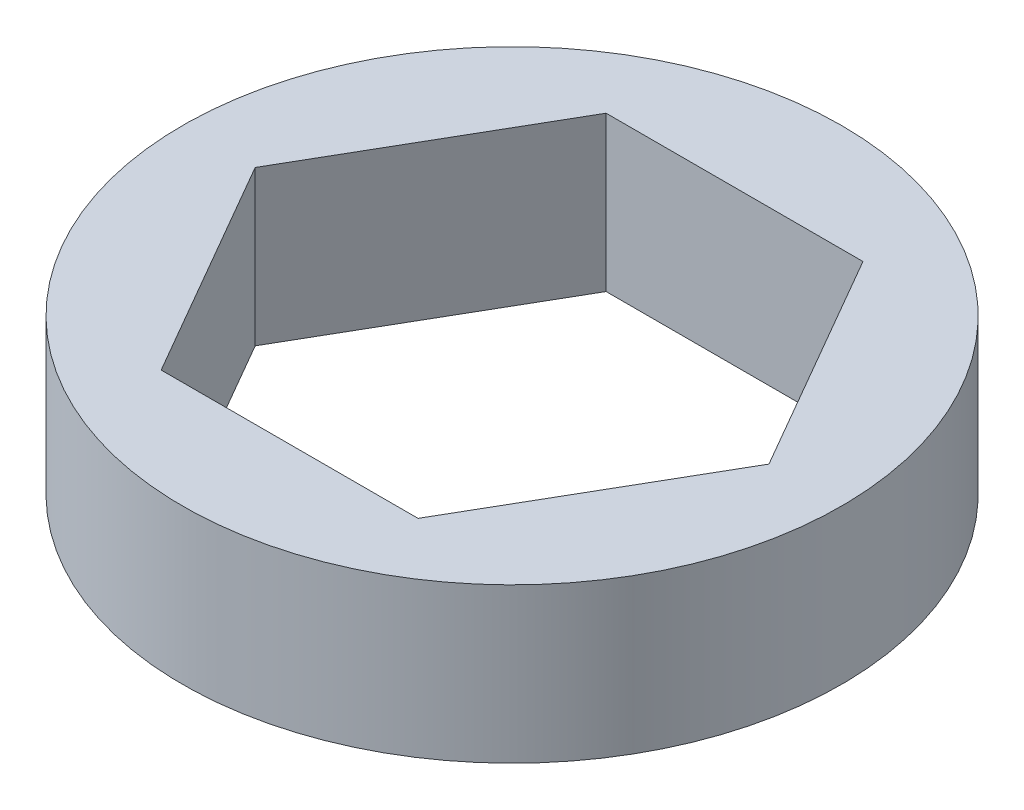
ISO-10303-21;
HEADER;
FILE_DESCRIPTION(('STEP AP214'),'2;1');
FILE_NAME('part.step','',(''),(''),'','','');
FILE_SCHEMA(('AUTOMOTIVE_DESIGN { 1 0 10303 214 1 1 1 1 }'));
ENDSEC;
DATA;
#1=APPLICATION_CONTEXT('core data for automotive mechanical design processes');
#2=APPLICATION_PROTOCOL_DEFINITION('international standard','automotive_design',2000,#1);
#3=PRODUCT_CONTEXT('',#1,'mechanical');
#4=PRODUCT('Part','Part','',(#3));
#5=PRODUCT_RELATED_PRODUCT_CATEGORY('part','',(#4));
#6=PRODUCT_DEFINITION_FORMATION('','',#4);
#7=PRODUCT_DEFINITION_CONTEXT('part definition',#1,'design');
#8=PRODUCT_DEFINITION('design','',#6,#7);
#9=PRODUCT_DEFINITION_SHAPE('','',#8);
#10=(LENGTH_UNIT() NAMED_UNIT(*) SI_UNIT(.MILLI.,.METRE.));
#11=(NAMED_UNIT(*) PLANE_ANGLE_UNIT() SI_UNIT($,.RADIAN.));
#12=(NAMED_UNIT(*) SI_UNIT($,.STERADIAN.) SOLID_ANGLE_UNIT());
#13=UNCERTAINTY_MEASURE_WITH_UNIT(LENGTH_MEASURE(1.E-05),#10,'distance_accuracy_value','');
#14=(GEOMETRIC_REPRESENTATION_CONTEXT(3) GLOBAL_UNCERTAINTY_ASSIGNED_CONTEXT((#13)) GLOBAL_UNIT_ASSIGNED_CONTEXT((#10,
#11,#12)) REPRESENTATION_CONTEXT('',''));
#15=CARTESIAN_POINT('',(0.,0.,0.));
#16=DIRECTION('',(0.,0.,1.));
#17=DIRECTION('',(1.,0.,0.));
#18=AXIS2_PLACEMENT_3D('',#15,#16,#17);
#19=CARTESIAN_POINT('',(0.,4.7625,0.));
#20=DIRECTION('',(0.,1.,0.));
#21=DIRECTION('',(0.,0.,1.));
#22=AXIS2_PLACEMENT_3D('',#19,#20,#21);
#23=PLANE('',#22);
#24=CARTESIAN_POINT('',(0.,4.7625,0.));
#25=DIRECTION('',(0.,1.,0.));
#26=DIRECTION('',(0.,0.,1.));
#27=AXIS2_PLACEMENT_3D('',#24,#25,#26);
#28=CIRCLE('',#27,10.16);
#29=CARTESIAN_POINT('',(0.,4.7625,-10.16));
#30=VERTEX_POINT('',#29);
#31=EDGE_CURVE('E11',#30,#30,#28,.T.);
#32=ORIENTED_EDGE('',*,*,#31,.T.);
#33=EDGE_LOOP('',(#32));
#34=FACE_BOUND('',#33,.T.);
#35=DIRECTION('',(-0.5,0.,-0.866025403784438));
#36=VECTOR('',#35,1.);
#37=CARTESIAN_POINT('',(7.9189362922049,4.7625,0.));
#38=LINE('',#37,#36);
#39=CARTESIAN_POINT('',(7.9189362922049,4.7625,0.));
#40=VERTEX_POINT('',#39);
#41=CARTESIAN_POINT('',(3.95946814610245,4.7625,-6.858));
#42=VERTEX_POINT('',#41);
#43=EDGE_CURVE('E102',#40,#42,#38,.T.);
#44=ORIENTED_EDGE('',*,*,#43,.F.);
#45=DIRECTION('',(0.5,0.,-0.866025403784439));
#46=VECTOR('',#45,1.);
#47=CARTESIAN_POINT('',(3.95946814610245,4.7625,6.858));
#48=LINE('',#47,#46);
#49=CARTESIAN_POINT('',(3.95946814610245,4.7625,6.858));
#50=VERTEX_POINT('',#49);
#51=EDGE_CURVE('E93',#50,#40,#48,.T.);
#52=ORIENTED_EDGE('',*,*,#51,.F.);
#53=DIRECTION('',(1.,0.,0.));
#54=VECTOR('',#53,1.);
#55=CARTESIAN_POINT('',(-3.95946814610245,4.7625,6.858));
#56=LINE('',#55,#54);
#57=CARTESIAN_POINT('',(-3.95946814610245,4.7625,6.858));
#58=VERTEX_POINT('',#57);
#59=EDGE_CURVE('E127',#58,#50,#56,.T.);
#60=ORIENTED_EDGE('',*,*,#59,.F.);
#61=DIRECTION('',(0.5,0.,0.866025403784439));
#62=VECTOR('',#61,1.);
#63=CARTESIAN_POINT('',(-7.91893629220491,4.7625,0.));
#64=LINE('',#63,#62);
#65=CARTESIAN_POINT('',(-7.91893629220491,4.7625,0.));
#66=VERTEX_POINT('',#65);
#67=EDGE_CURVE('E124',#66,#58,#64,.T.);
#68=ORIENTED_EDGE('',*,*,#67,.F.);
#69=DIRECTION('',(-0.5,0.,0.866025403784439));
#70=VECTOR('',#69,1.);
#71=CARTESIAN_POINT('',(-3.95946814610245,4.7625,-6.858));
#72=LINE('',#71,#70);
#73=CARTESIAN_POINT('',(-3.95946814610245,4.7625,-6.858));
#74=VERTEX_POINT('',#73);
#75=EDGE_CURVE('E119',#74,#66,#72,.T.);
#76=ORIENTED_EDGE('',*,*,#75,.F.);
#77=DIRECTION('',(-1.,0.,0.));
#78=VECTOR('',#77,1.);
#79=CARTESIAN_POINT('',(3.95946814610245,4.7625,-6.858));
#80=LINE('',#79,#78);
#81=EDGE_CURVE('E115',#42,#74,#80,.T.);
#82=ORIENTED_EDGE('',*,*,#81,.F.);
#83=EDGE_LOOP('',(#44,#52,#60,#68,#76,#82));
#84=FACE_BOUND('',#83,.T.);
#85=ADVANCED_FACE('F39',(#34,#84),#23,.T.);
#86=CARTESIAN_POINT('',(0.,0.,0.));
#87=DIRECTION('',(0.,1.,0.));
#88=DIRECTION('',(0.,0.,1.));
#89=AXIS2_PLACEMENT_3D('',#86,#87,#88);
#90=PLANE('',#89);
#91=CARTESIAN_POINT('',(0.,0.,0.));
#92=DIRECTION('',(0.,1.,0.));
#93=DIRECTION('',(0.,0.,1.));
#94=AXIS2_PLACEMENT_3D('',#91,#92,#93);
#95=CIRCLE('',#94,10.16);
#96=CARTESIAN_POINT('',(0.,0.,-10.16));
#97=VERTEX_POINT('',#96);
#98=EDGE_CURVE('E43',#97,#97,#95,.T.);
#99=ORIENTED_EDGE('',*,*,#98,.F.);
#100=EDGE_LOOP('',(#99));
#101=FACE_BOUND('',#100,.T.);
#102=DIRECTION('',(0.5,0.,-0.866025403784439));
#103=VECTOR('',#102,1.);
#104=CARTESIAN_POINT('',(3.95946814610245,0.,6.858));
#105=LINE('',#104,#103);
#106=CARTESIAN_POINT('',(3.95946814610245,0.,6.858));
#107=VERTEX_POINT('',#106);
#108=CARTESIAN_POINT('',(7.9189362922049,0.,0.));
#109=VERTEX_POINT('',#108);
#110=EDGE_CURVE('E63',#107,#109,#105,.T.);
#111=ORIENTED_EDGE('',*,*,#110,.T.);
#112=DIRECTION('',(-0.5,0.,-0.866025403784438));
#113=VECTOR('',#112,1.);
#114=CARTESIAN_POINT('',(7.9189362922049,0.,0.));
#115=LINE('',#114,#113);
#116=CARTESIAN_POINT('',(3.95946814610245,0.,-6.858));
#117=VERTEX_POINT('',#116);
#118=EDGE_CURVE('E109',#109,#117,#115,.T.);
#119=ORIENTED_EDGE('',*,*,#118,.T.);
#120=DIRECTION('',(-1.,0.,0.));
#121=VECTOR('',#120,1.);
#122=CARTESIAN_POINT('',(3.95946814610245,0.,-6.858));
#123=LINE('',#122,#121);
#124=CARTESIAN_POINT('',(-3.95946814610245,0.,-6.858));
#125=VERTEX_POINT('',#124);
#126=EDGE_CURVE('E134',#117,#125,#123,.T.);
#127=ORIENTED_EDGE('',*,*,#126,.T.);
#128=DIRECTION('',(-0.5,0.,0.866025403784439));
#129=VECTOR('',#128,1.);
#130=CARTESIAN_POINT('',(-3.95946814610245,0.,-6.858));
#131=LINE('',#130,#129);
#132=CARTESIAN_POINT('',(-7.91893629220491,0.,0.));
#133=VERTEX_POINT('',#132);
#134=EDGE_CURVE('E138',#125,#133,#131,.T.);
#135=ORIENTED_EDGE('',*,*,#134,.T.);
#136=DIRECTION('',(0.5,0.,0.866025403784439));
#137=VECTOR('',#136,1.);
#138=CARTESIAN_POINT('',(-7.91893629220491,0.,0.));
#139=LINE('',#138,#137);
#140=CARTESIAN_POINT('',(-3.95946814610245,0.,6.858));
#141=VERTEX_POINT('',#140);
#142=EDGE_CURVE('E142',#133,#141,#139,.T.);
#143=ORIENTED_EDGE('',*,*,#142,.T.);
#144=DIRECTION('',(1.,0.,0.));
#145=VECTOR('',#144,1.);
#146=CARTESIAN_POINT('',(-3.95946814610245,0.,6.858));
#147=LINE('',#146,#145);
#148=EDGE_CURVE('E103',#141,#107,#147,.T.);
#149=ORIENTED_EDGE('',*,*,#148,.T.);
#150=EDGE_LOOP('',(#111,#119,#127,#135,#143,#149));
#151=FACE_BOUND('',#150,.T.);
#152=ADVANCED_FACE('F166',(#101,#151),#90,.F.);
#153=CARTESIAN_POINT('',(0.,4.7625,0.));
#154=DIRECTION('',(0.,-1.,0.));
#155=DIRECTION('',(0.,0.,-1.));
#156=AXIS2_PLACEMENT_3D('',#153,#154,#155);
#157=CYLINDRICAL_SURFACE('',#156,10.16);
#158=CARTESIAN_POINT('',(0.,4.7625,-10.16));
#159=CARTESIAN_POINT('',(0.,4.712890625,-10.16));
#160=CARTESIAN_POINT('',(0.,4.66328125,-10.16));
#161=CARTESIAN_POINT('',(0.,4.5640625,-10.16));
#162=CARTESIAN_POINT('',(0.,4.514453125,-10.16));
#163=CARTESIAN_POINT('',(0.,4.415234375,-10.16));
#164=CARTESIAN_POINT('',(0.,4.365625,-10.16));
#165=CARTESIAN_POINT('',(0.,4.26640625,-10.16));
#166=CARTESIAN_POINT('',(0.,4.216796875,-10.16));
#167=CARTESIAN_POINT('',(0.,4.117578125,-10.16));
#168=CARTESIAN_POINT('',(0.,4.06796875,-10.16));
#169=CARTESIAN_POINT('',(0.,3.96875,-10.16));
#170=CARTESIAN_POINT('',(0.,3.919140625,-10.16));
#171=CARTESIAN_POINT('',(0.,3.819921875,-10.16));
#172=CARTESIAN_POINT('',(0.,3.7703125,-10.16));
#173=CARTESIAN_POINT('',(0.,3.67109375,-10.16));
#174=CARTESIAN_POINT('',(0.,3.621484375,-10.16));
#175=CARTESIAN_POINT('',(0.,3.522265625,-10.16));
#176=CARTESIAN_POINT('',(0.,3.47265625,-10.16));
#177=CARTESIAN_POINT('',(0.,3.3734375,-10.16));
#178=CARTESIAN_POINT('',(0.,3.323828125,-10.16));
#179=CARTESIAN_POINT('',(0.,3.224609375,-10.16));
#180=CARTESIAN_POINT('',(0.,3.175,-10.16));
#181=CARTESIAN_POINT('',(0.,3.07578125,-10.16));
#182=CARTESIAN_POINT('',(0.,3.026171875,-10.16));
#183=CARTESIAN_POINT('',(0.,2.926953125,-10.16));
#184=CARTESIAN_POINT('',(0.,2.87734375,-10.16));
#185=CARTESIAN_POINT('',(0.,2.778125,-10.16));
#186=CARTESIAN_POINT('',(0.,2.728515625,-10.16));
#187=CARTESIAN_POINT('',(0.,2.629296875,-10.16));
#188=CARTESIAN_POINT('',(0.,2.5796875,-10.16));
#189=CARTESIAN_POINT('',(0.,2.48046875,-10.16));
#190=CARTESIAN_POINT('',(0.,2.430859375,-10.16));
#191=CARTESIAN_POINT('',(0.,2.331640625,-10.16));
#192=CARTESIAN_POINT('',(0.,2.28203125,-10.16));
#193=CARTESIAN_POINT('',(0.,2.1828125,-10.16));
#194=CARTESIAN_POINT('',(0.,2.133203125,-10.16));
#195=CARTESIAN_POINT('',(0.,2.033984375,-10.16));
#196=CARTESIAN_POINT('',(0.,1.984375,-10.16));
#197=CARTESIAN_POINT('',(0.,1.88515625,-10.16));
#198=CARTESIAN_POINT('',(0.,1.835546875,-10.16));
#199=CARTESIAN_POINT('',(0.,1.736328125,-10.16));
#200=CARTESIAN_POINT('',(0.,1.68671875,-10.16));
#201=CARTESIAN_POINT('',(0.,1.5875,-10.16));
#202=CARTESIAN_POINT('',(0.,1.537890625,-10.16));
#203=CARTESIAN_POINT('',(0.,1.438671875,-10.16));
#204=CARTESIAN_POINT('',(0.,1.3890625,-10.16));
#205=CARTESIAN_POINT('',(0.,1.28984375,-10.16));
#206=CARTESIAN_POINT('',(0.,1.240234375,-10.16));
#207=CARTESIAN_POINT('',(0.,1.141015625,-10.16));
#208=CARTESIAN_POINT('',(0.,1.09140625,-10.16));
#209=CARTESIAN_POINT('',(0.,0.9921875,-10.16));
#210=CARTESIAN_POINT('',(0.,0.942578125,-10.16));
#211=CARTESIAN_POINT('',(0.,0.843359375,-10.16));
#212=CARTESIAN_POINT('',(0.,0.79375,-10.16));
#213=CARTESIAN_POINT('',(0.,0.69453125,-10.16));
#214=CARTESIAN_POINT('',(0.,0.644921875,-10.16));
#215=CARTESIAN_POINT('',(0.,0.545703125,-10.16));
#216=CARTESIAN_POINT('',(0.,0.49609375,-10.16));
#217=CARTESIAN_POINT('',(0.,0.396875,-10.16));
#218=CARTESIAN_POINT('',(0.,0.347265625,-10.16));
#219=CARTESIAN_POINT('',(0.,0.248046875,-10.16));
#220=CARTESIAN_POINT('',(0.,0.1984375,-10.16));
#221=CARTESIAN_POINT('',(0.,0.09921875,-10.16));
#222=CARTESIAN_POINT('',(0.,0.049609375,-10.16));
#223=CARTESIAN_POINT('',(0.,0.,-10.16));
#224=B_SPLINE_CURVE_WITH_KNOTS('',3,(#158,#159,#160,#161,#162,#163,#164,#165,#166,#167,#168,
#169,#170,#171,#172,#173,#174,#175,#176,#177,#178,#179,#180,#181,#182,#183,#184,#185,#186,#187,
#188,#189,#190,#191,#192,#193,#194,#195,#196,#197,#198,#199,#200,#201,#202,#203,#204,#205,#206,
#207,#208,#209,#210,#211,#212,#213,#214,#215,#216,#217,#218,#219,#220,#221,#222,#223),
.UNSPECIFIED.,.F.,.F.,(4,2,2,2,2,2,2,2,2,2,2,2,2,2,2,2,2,2,2,2,2,2,2,2,2,2,2,2,2,2,2,2,4),(0.,
0.148828124999999,0.297656249999999,0.446484374999999,0.595312499999999,0.744140625,0.89296875,
1.041796875,1.190625,1.339453125,1.48828125,1.637109375,1.7859375,1.934765625,2.08359375,
2.232421875,2.38125,2.530078125,2.67890625,2.827734375,2.9765625,3.125390625,3.27421875,
3.423046875,3.571875,3.720703125,3.86953125,4.018359375,4.1671875,4.316015625,4.46484375,
4.613671875,4.7625),.UNSPECIFIED.);
#225=EDGE_CURVE('BSEAM41',#30,#97,#224,.T.);
#226=ORIENTED_EDGE('',*,*,#31,.F.);
#227=ORIENTED_EDGE('',*,*,#98,.T.);
#228=ORIENTED_EDGE('',*,*,#225,.T.);
#229=ORIENTED_EDGE('',*,*,#225,.F.);
#230=EDGE_LOOP('',(#226,#228,#227,#229));
#231=FACE_BOUND('',#230,.T.);
#232=ADVANCED_FACE('F41',(#231),#157,.T.);
#233=CARTESIAN_POINT('',(3.95946814610245,4.7625,6.858));
#234=DIRECTION('',(-0.866025403784439,0.,-0.5));
#235=DIRECTION('',(-0.5,0.,0.866025403784439));
#236=AXIS2_PLACEMENT_3D('',#233,#234,#235);
#237=PLANE('',#236);
#238=ORIENTED_EDGE('',*,*,#110,.F.);
#239=DIRECTION('',(0.,-1.,0.));
#240=VECTOR('',#239,1.);
#241=CARTESIAN_POINT('',(3.95946814610245,4.7625,6.858));
#242=LINE('',#241,#240);
#243=EDGE_CURVE('E97',#50,#107,#242,.T.);
#244=ORIENTED_EDGE('',*,*,#243,.F.);
#245=ORIENTED_EDGE('',*,*,#51,.T.);
#246=DIRECTION('',(0.,-1.,0.));
#247=VECTOR('',#246,1.);
#248=CARTESIAN_POINT('',(7.9189362922049,4.7625,0.));
#249=LINE('',#248,#247);
#250=EDGE_CURVE('E96',#40,#109,#249,.T.);
#251=ORIENTED_EDGE('',*,*,#250,.T.);
#252=EDGE_LOOP('',(#238,#244,#245,#251));
#253=FACE_BOUND('',#252,.T.);
#254=ADVANCED_FACE('F95',(#253),#237,.T.);
#255=CARTESIAN_POINT('',(7.9189362922049,4.7625,0.));
#256=DIRECTION('',(-0.866025403784439,0.,0.5));
#257=DIRECTION('',(0.5,0.,0.866025403784439));
#258=AXIS2_PLACEMENT_3D('',#255,#256,#257);
#259=PLANE('',#258);
#260=ORIENTED_EDGE('',*,*,#118,.F.);
#261=ORIENTED_EDGE('',*,*,#250,.F.);
#262=ORIENTED_EDGE('',*,*,#43,.T.);
#263=DIRECTION('',(0.,-1.,0.));
#264=VECTOR('',#263,1.);
#265=CARTESIAN_POINT('',(3.95946814610245,4.7625,-6.858));
#266=LINE('',#265,#264);
#267=EDGE_CURVE('E111',#42,#117,#266,.T.);
#268=ORIENTED_EDGE('',*,*,#267,.T.);
#269=EDGE_LOOP('',(#260,#261,#262,#268));
#270=FACE_BOUND('',#269,.T.);
#271=ADVANCED_FACE('F106',(#270),#259,.T.);
#272=CARTESIAN_POINT('',(3.95946814610245,4.7625,-6.858));
#273=DIRECTION('',(0.,0.,1.));
#274=DIRECTION('',(1.,0.,0.));
#275=AXIS2_PLACEMENT_3D('',#272,#273,#274);
#276=PLANE('',#275);
#277=ORIENTED_EDGE('',*,*,#126,.F.);
#278=ORIENTED_EDGE('',*,*,#267,.F.);
#279=ORIENTED_EDGE('',*,*,#81,.T.);
#280=DIRECTION('',(0.,-1.,0.));
#281=VECTOR('',#280,1.);
#282=CARTESIAN_POINT('',(-3.95946814610245,4.7625,-6.858));
#283=LINE('',#282,#281);
#284=EDGE_CURVE('E156',#74,#125,#283,.T.);
#285=ORIENTED_EDGE('',*,*,#284,.T.);
#286=EDGE_LOOP('',(#277,#278,#279,#285));
#287=FACE_BOUND('',#286,.T.);
#288=ADVANCED_FACE('F162',(#287),#276,.T.);
#289=CARTESIAN_POINT('',(-3.95946814610245,4.7625,-6.858));
#290=DIRECTION('',(0.866025403784439,0.,0.5));
#291=DIRECTION('',(0.5,0.,-0.866025403784439));
#292=AXIS2_PLACEMENT_3D('',#289,#290,#291);
#293=PLANE('',#292);
#294=ORIENTED_EDGE('',*,*,#134,.F.);
#295=ORIENTED_EDGE('',*,*,#284,.F.);
#296=ORIENTED_EDGE('',*,*,#75,.T.);
#297=DIRECTION('',(0.,-1.,0.));
#298=VECTOR('',#297,1.);
#299=CARTESIAN_POINT('',(-7.91893629220491,4.7625,0.));
#300=LINE('',#299,#298);
#301=EDGE_CURVE('E153',#66,#133,#300,.T.);
#302=ORIENTED_EDGE('',*,*,#301,.T.);
#303=EDGE_LOOP('',(#294,#295,#296,#302));
#304=FACE_BOUND('',#303,.T.);
#305=ADVANCED_FACE('F174',(#304),#293,.T.);
#306=CARTESIAN_POINT('',(-7.91893629220491,4.7625,0.));
#307=DIRECTION('',(0.866025403784439,0.,-0.5));
#308=DIRECTION('',(-0.5,0.,-0.866025403784438));
#309=AXIS2_PLACEMENT_3D('',#306,#307,#308);
#310=PLANE('',#309);
#311=ORIENTED_EDGE('',*,*,#142,.F.);
#312=ORIENTED_EDGE('',*,*,#301,.F.);
#313=ORIENTED_EDGE('',*,*,#67,.T.);
#314=DIRECTION('',(0.,-1.,0.));
#315=VECTOR('',#314,1.);
#316=CARTESIAN_POINT('',(-3.95946814610245,4.7625,6.858));
#317=LINE('',#316,#315);
#318=EDGE_CURVE('E55',#58,#141,#317,.T.);
#319=ORIENTED_EDGE('',*,*,#318,.T.);
#320=EDGE_LOOP('',(#311,#312,#313,#319));
#321=FACE_BOUND('',#320,.T.);
#322=ADVANCED_FACE('F172',(#321),#310,.T.);
#323=CARTESIAN_POINT('',(-3.95946814610245,4.7625,6.858));
#324=DIRECTION('',(0.,0.,-1.));
#325=DIRECTION('',(-1.,0.,0.));
#326=AXIS2_PLACEMENT_3D('',#323,#324,#325);
#327=PLANE('',#326);
#328=ORIENTED_EDGE('',*,*,#148,.F.);
#329=ORIENTED_EDGE('',*,*,#318,.F.);
#330=ORIENTED_EDGE('',*,*,#59,.T.);
#331=ORIENTED_EDGE('',*,*,#243,.T.);
#332=EDGE_LOOP('',(#328,#329,#330,#331));
#333=FACE_BOUND('',#332,.T.);
#334=ADVANCED_FACE('F168',(#333),#327,.T.);
#335=CLOSED_SHELL('',(#85,#152,#232,#254,#271,#288,#305,#322,#334));
#336=MANIFOLD_SOLID_BREP('B2',#335);
#337=ADVANCED_BREP_SHAPE_REPRESENTATION('',(#18,#336),#14);
#338=SHAPE_DEFINITION_REPRESENTATION(#9,#337);
ENDSEC;
END-ISO-10303-21;
